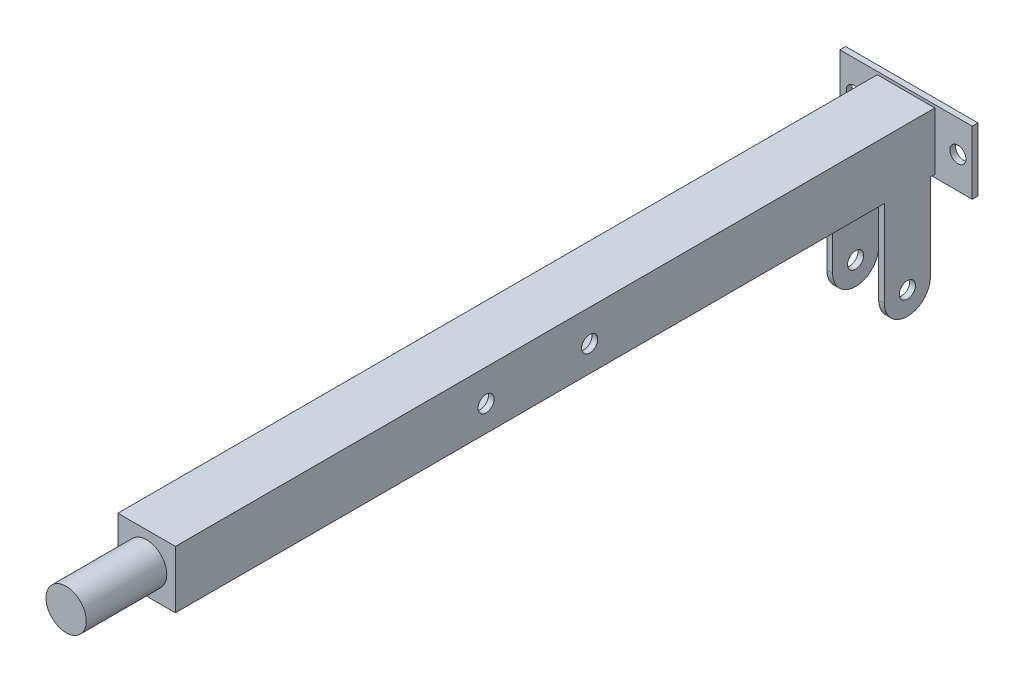
ISO-10303-21;
HEADER;
FILE_DESCRIPTION(('STEP AP214'),'2;1');
FILE_NAME('part.step','',(''),(''),'','','');
FILE_SCHEMA(('AUTOMOTIVE_DESIGN { 1 0 10303 214 1 1 1 1 }'));
ENDSEC;
DATA;
#1=APPLICATION_CONTEXT('core data for automotive mechanical design processes');
#2=APPLICATION_PROTOCOL_DEFINITION('international standard','automotive_design',2000,#1);
#3=PRODUCT_CONTEXT('',#1,'mechanical');
#4=PRODUCT('Part','Part','',(#3));
#5=PRODUCT_RELATED_PRODUCT_CATEGORY('part','',(#4));
#6=PRODUCT_DEFINITION_FORMATION('','',#4);
#7=PRODUCT_DEFINITION_CONTEXT('part definition',#1,'design');
#8=PRODUCT_DEFINITION('design','',#6,#7);
#9=PRODUCT_DEFINITION_SHAPE('','',#8);
#10=(LENGTH_UNIT() NAMED_UNIT(*) SI_UNIT(.MILLI.,.METRE.));
#11=(NAMED_UNIT(*) PLANE_ANGLE_UNIT() SI_UNIT($,.RADIAN.));
#12=(NAMED_UNIT(*) SI_UNIT($,.STERADIAN.) SOLID_ANGLE_UNIT());
#13=UNCERTAINTY_MEASURE_WITH_UNIT(LENGTH_MEASURE(1.E-05),#10,'distance_accuracy_value','');
#14=(GEOMETRIC_REPRESENTATION_CONTEXT(3) GLOBAL_UNCERTAINTY_ASSIGNED_CONTEXT((#13)) GLOBAL_UNIT_ASSIGNED_CONTEXT((#10,
#11,#12)) REPRESENTATION_CONTEXT('',''));
#15=CARTESIAN_POINT('',(0.,0.,0.));
#16=DIRECTION('',(0.,0.,1.));
#17=DIRECTION('',(1.,0.,0.));
#18=AXIS2_PLACEMENT_3D('',#15,#16,#17);
#19=CARTESIAN_POINT('',(-25.,-25.,0.));
#20=DIRECTION('',(0.,-1.,0.));
#21=DIRECTION('',(1.,0.,0.));
#22=AXIS2_PLACEMENT_3D('',#19,#20,#21);
#23=PLANE('',#22);
#24=DIRECTION('',(0.,0.,-1.));
#25=VECTOR('',#24,1.);
#26=CARTESIAN_POINT('',(25.,-25.,0.));
#27=LINE('',#26,#25);
#28=CARTESIAN_POINT('',(25.,-25.,-656.140431975243));
#29=VERTEX_POINT('',#28);
#30=CARTESIAN_POINT('',(25.,-25.,-660.));
#31=VERTEX_POINT('',#30);
#32=EDGE_CURVE('E206',#29,#31,#27,.T.);
#33=ORIENTED_EDGE('',*,*,#32,.F.);
#34=DIRECTION('',(1.,0.,0.));
#35=VECTOR('',#34,1.);
#36=CARTESIAN_POINT('',(20.,-25.,-656.140431975243));
#37=LINE('',#36,#35);
#38=CARTESIAN_POINT('',(20.,-25.,-656.140431975243));
#39=VERTEX_POINT('',#38);
#40=EDGE_CURVE('E188',#39,#29,#37,.T.);
#41=ORIENTED_EDGE('',*,*,#40,.F.);
#42=DIRECTION('',(0.,0.,1.));
#43=VECTOR('',#42,1.);
#44=CARTESIAN_POINT('',(20.,-25.,0.));
#45=LINE('',#44,#43);
#46=CARTESIAN_POINT('',(20.,-25.,-616.140431975243));
#47=VERTEX_POINT('',#46);
#48=EDGE_CURVE('E194',#39,#47,#45,.T.);
#49=ORIENTED_EDGE('',*,*,#48,.T.);
#50=DIRECTION('',(1.,0.,0.));
#51=VECTOR('',#50,1.);
#52=CARTESIAN_POINT('',(20.,-25.,-616.140431975243));
#53=LINE('',#52,#51);
#54=CARTESIAN_POINT('',(25.,-25.,-616.140431975243));
#55=VERTEX_POINT('',#54);
#56=EDGE_CURVE('E208',#47,#55,#53,.T.);
#57=ORIENTED_EDGE('',*,*,#56,.T.);
#58=CARTESIAN_POINT('',(25.,-25.,0.));
#59=VERTEX_POINT('',#58);
#60=EDGE_CURVE('E384',#59,#55,#27,.T.);
#61=ORIENTED_EDGE('',*,*,#60,.F.);
#62=DIRECTION('',(-1.,0.,0.));
#63=VECTOR('',#62,1.);
#64=CARTESIAN_POINT('',(-25.,-25.,0.));
#65=LINE('',#64,#63);
#66=CARTESIAN_POINT('',(-25.,-25.,0.));
#67=VERTEX_POINT('',#66);
#68=EDGE_CURVE('E380',#59,#67,#65,.T.);
#69=ORIENTED_EDGE('',*,*,#68,.T.);
#70=DIRECTION('',(0.,0.,-1.));
#71=VECTOR('',#70,1.);
#72=CARTESIAN_POINT('',(-25.,-25.,0.));
#73=LINE('',#72,#71);
#74=CARTESIAN_POINT('',(-25.,-25.,-616.140431975243));
#75=VERTEX_POINT('',#74);
#76=EDGE_CURVE('E358',#67,#75,#73,.T.);
#77=ORIENTED_EDGE('',*,*,#76,.T.);
#78=DIRECTION('',(-1.,0.,0.));
#79=VECTOR('',#78,1.);
#80=CARTESIAN_POINT('',(-20.,-25.,-616.140431975243));
#81=LINE('',#80,#79);
#82=CARTESIAN_POINT('',(-20.,-25.,-616.140431975243));
#83=VERTEX_POINT('',#82);
#84=EDGE_CURVE('E254',#83,#75,#81,.T.);
#85=ORIENTED_EDGE('',*,*,#84,.F.);
#86=DIRECTION('',(0.,0.,1.));
#87=VECTOR('',#86,1.);
#88=CARTESIAN_POINT('',(-20.,-25.,0.));
#89=LINE('',#88,#87);
#90=CARTESIAN_POINT('',(-20.,-25.,-656.140431975243));
#91=VERTEX_POINT('',#90);
#92=EDGE_CURVE('E69',#91,#83,#89,.T.);
#93=ORIENTED_EDGE('',*,*,#92,.F.);
#94=DIRECTION('',(-1.,0.,0.));
#95=VECTOR('',#94,1.);
#96=CARTESIAN_POINT('',(-20.,-25.,-656.140431975243));
#97=LINE('',#96,#95);
#98=CARTESIAN_POINT('',(-25.,-25.,-656.140431975243));
#99=VERTEX_POINT('',#98);
#100=EDGE_CURVE('E250',#91,#99,#97,.T.);
#101=ORIENTED_EDGE('',*,*,#100,.T.);
#102=CARTESIAN_POINT('',(-25.,-25.,-660.));
#103=VERTEX_POINT('',#102);
#104=EDGE_CURVE('E365',#99,#103,#73,.T.);
#105=ORIENTED_EDGE('',*,*,#104,.T.);
#106=DIRECTION('',(-1.,0.,0.));
#107=VECTOR('',#106,1.);
#108=CARTESIAN_POINT('',(-25.,-25.,-660.));
#109=LINE('',#108,#107);
#110=EDGE_CURVE('E388',#31,#103,#109,.T.);
#111=ORIENTED_EDGE('',*,*,#110,.F.);
#112=EDGE_LOOP('',(#33,#41,#49,#57,#61,#69,#77,#85,#93,#101,#105,#111));
#113=FACE_BOUND('',#112,.T.);
#114=ADVANCED_FACE('F43',(#113),#23,.T.);
#115=CARTESIAN_POINT('',(0.,0.,70.));
#116=DIRECTION('',(0.,0.,-1.));
#117=DIRECTION('',(-1.,0.,0.));
#118=AXIS2_PLACEMENT_3D('',#115,#116,#117);
#119=CYLINDRICAL_SURFACE('',#118,17.5);
#120=CARTESIAN_POINT('',(0.,0.,70.));
#121=DIRECTION('',(0.,0.,1.));
#122=DIRECTION('',(1.,0.,0.));
#123=AXIS2_PLACEMENT_3D('',#120,#121,#122);
#124=CIRCLE('',#123,17.5);
#125=CARTESIAN_POINT('',(17.5,0.,70.));
#126=VERTEX_POINT('',#125);
#127=EDGE_CURVE('E396',#126,#126,#124,.T.);
#128=ORIENTED_EDGE('',*,*,#127,.F.);
#129=EDGE_LOOP('',(#128));
#130=FACE_BOUND('',#129,.T.);
#131=CARTESIAN_POINT('',(0.,0.,0.));
#132=DIRECTION('',(0.,0.,1.));
#133=DIRECTION('',(1.,0.,0.));
#134=AXIS2_PLACEMENT_3D('',#131,#132,#133);
#135=CIRCLE('',#134,17.5);
#136=CARTESIAN_POINT('',(17.5,0.,0.));
#137=VERTEX_POINT('',#136);
#138=EDGE_CURVE('E395',#137,#137,#135,.T.);
#139=ORIENTED_EDGE('',*,*,#138,.T.);
#140=EDGE_LOOP('',(#139));
#141=FACE_BOUND('',#140,.T.);
#142=ADVANCED_FACE('F45',(#130,#141),#119,.T.);
#143=CARTESIAN_POINT('',(0.,0.,70.));
#144=DIRECTION('',(0.,0.,1.));
#145=DIRECTION('',(1.,0.,0.));
#146=AXIS2_PLACEMENT_3D('',#143,#144,#145);
#147=PLANE('',#146);
#148=ORIENTED_EDGE('',*,*,#127,.T.);
#149=EDGE_LOOP('',(#148));
#150=FACE_BOUND('',#149,.T.);
#151=ADVANCED_FACE('F566',(#150),#147,.T.);
#152=CARTESIAN_POINT('',(0.,0.,0.));
#153=DIRECTION('',(0.,0.,-1.));
#154=DIRECTION('',(-1.,0.,0.));
#155=AXIS2_PLACEMENT_3D('',#152,#153,#154);
#156=PLANE('',#155);
#157=ORIENTED_EDGE('',*,*,#138,.F.);
#158=EDGE_LOOP('',(#157));
#159=FACE_BOUND('',#158,.T.);
#160=DIRECTION('',(0.,-1.,0.));
#161=VECTOR('',#160,1.);
#162=CARTESIAN_POINT('',(25.,-25.,0.));
#163=LINE('',#162,#161);
#164=CARTESIAN_POINT('',(25.,25.,0.));
#165=VERTEX_POINT('',#164);
#166=EDGE_CURVE('E369',#165,#59,#163,.T.);
#167=ORIENTED_EDGE('',*,*,#166,.F.);
#168=DIRECTION('',(1.,0.,0.));
#169=VECTOR('',#168,1.);
#170=CARTESIAN_POINT('',(-25.,25.,0.));
#171=LINE('',#170,#169);
#172=CARTESIAN_POINT('',(-25.,25.,0.));
#173=VERTEX_POINT('',#172);
#174=EDGE_CURVE('E352',#173,#165,#171,.T.);
#175=ORIENTED_EDGE('',*,*,#174,.F.);
#176=DIRECTION('',(0.,1.,0.));
#177=VECTOR('',#176,1.);
#178=CARTESIAN_POINT('',(-25.,-25.,0.));
#179=LINE('',#178,#177);
#180=EDGE_CURVE('E348',#67,#173,#179,.T.);
#181=ORIENTED_EDGE('',*,*,#180,.F.);
#182=ORIENTED_EDGE('',*,*,#68,.F.);
#183=EDGE_LOOP('',(#167,#175,#181,#182));
#184=FACE_BOUND('',#183,.T.);
#185=ADVANCED_FACE('F564',(#159,#184),#156,.F.);
#186=CARTESIAN_POINT('',(-25.,-25.,0.));
#187=DIRECTION('',(-1.,0.,0.));
#188=DIRECTION('',(0.,0.,1.));
#189=AXIS2_PLACEMENT_3D('',#186,#187,#188);
#190=PLANE('',#189);
#191=CARTESIAN_POINT('',(-25.,-2.50000000001238,-270.000000000014));
#192=DIRECTION('',(-1.,0.,0.));
#193=DIRECTION('',(0.,0.,1.));
#194=AXIS2_PLACEMENT_3D('',#191,#192,#193);
#195=CIRCLE('',#194,6.99999999999999);
#196=CARTESIAN_POINT('',(-25.,-2.50000000001238,-263.000000000014));
#197=VERTEX_POINT('',#196);
#198=EDGE_CURVE('E451',#197,#197,#195,.T.);
#199=ORIENTED_EDGE('',*,*,#198,.F.);
#200=EDGE_LOOP('',(#199));
#201=FACE_BOUND('',#200,.T.);
#202=CARTESIAN_POINT('',(-25.,-2.50000000001238,-360.000000000014));
#203=DIRECTION('',(-1.,0.,0.));
#204=DIRECTION('',(0.,0.,1.));
#205=AXIS2_PLACEMENT_3D('',#202,#203,#204);
#206=CIRCLE('',#205,6.99999999999999);
#207=CARTESIAN_POINT('',(-25.,-2.50000000001238,-353.000000000014));
#208=VERTEX_POINT('',#207);
#209=EDGE_CURVE('E437',#208,#208,#206,.T.);
#210=ORIENTED_EDGE('',*,*,#209,.F.);
#211=EDGE_LOOP('',(#210));
#212=FACE_BOUND('',#211,.T.);
#213=CARTESIAN_POINT('',(-25.,-100.,-636.140431975243));
#214=DIRECTION('',(-1.,0.,0.));
#215=DIRECTION('',(0.,0.,1.));
#216=AXIS2_PLACEMENT_3D('',#213,#214,#215);
#217=CIRCLE('',#216,7.00000000000004);
#218=CARTESIAN_POINT('',(-25.,-100.,-629.140431975243));
#219=VERTEX_POINT('',#218);
#220=EDGE_CURVE('E219',#219,#219,#217,.T.);
#221=ORIENTED_EDGE('',*,*,#220,.F.);
#222=EDGE_LOOP('',(#221));
#223=FACE_BOUND('',#222,.T.);
#224=DIRECTION('',(0.,0.,-1.));
#225=VECTOR('',#224,1.);
#226=CARTESIAN_POINT('',(-25.,25.,0.));
#227=LINE('',#226,#225);
#228=CARTESIAN_POINT('',(-25.,25.,-660.));
#229=VERTEX_POINT('',#228);
#230=EDGE_CURVE('E357',#173,#229,#227,.T.);
#231=ORIENTED_EDGE('',*,*,#230,.T.);
#232=DIRECTION('',(0.,1.,0.));
#233=VECTOR('',#232,1.);
#234=CARTESIAN_POINT('',(-25.,-25.,-660.));
#235=LINE('',#234,#233);
#236=EDGE_CURVE('E353',#103,#229,#235,.T.);
#237=ORIENTED_EDGE('',*,*,#236,.F.);
#238=ORIENTED_EDGE('',*,*,#104,.F.);
#239=DIRECTION('',(0.,-1.,0.));
#240=VECTOR('',#239,1.);
#241=CARTESIAN_POINT('',(-25.,0.,-656.140431975243));
#242=LINE('',#241,#240);
#243=CARTESIAN_POINT('',(-25.,-100.,-656.140431975243));
#244=VERTEX_POINT('',#243);
#245=EDGE_CURVE('E239',#99,#244,#242,.T.);
#246=ORIENTED_EDGE('',*,*,#245,.T.);
#247=CARTESIAN_POINT('',(-25.,-100.,-636.140431975243));
#248=DIRECTION('',(-1.,0.,0.));
#249=DIRECTION('',(0.,0.,1.));
#250=AXIS2_PLACEMENT_3D('',#247,#248,#249);
#251=CIRCLE('',#250,20.);
#252=CARTESIAN_POINT('',(-25.,-100.,-616.140431975243));
#253=VERTEX_POINT('',#252);
#254=EDGE_CURVE('E243',#244,#253,#251,.T.);
#255=ORIENTED_EDGE('',*,*,#254,.T.);
#256=DIRECTION('',(0.,-1.,0.));
#257=VECTOR('',#256,1.);
#258=CARTESIAN_POINT('',(-25.,0.,-616.140431975243));
#259=LINE('',#258,#257);
#260=EDGE_CURVE('E229',#75,#253,#259,.T.);
#261=ORIENTED_EDGE('',*,*,#260,.F.);
#262=ORIENTED_EDGE('',*,*,#76,.F.);
#263=ORIENTED_EDGE('',*,*,#180,.T.);
#264=EDGE_LOOP('',(#231,#237,#238,#246,#255,#261,#262,#263));
#265=FACE_BOUND('',#264,.T.);
#266=ADVANCED_FACE('F484',(#201,#212,#223,#265),#190,.T.);
#267=CARTESIAN_POINT('',(-25.,25.,0.));
#268=DIRECTION('',(0.,1.,0.));
#269=DIRECTION('',(-1.,0.,0.));
#270=AXIS2_PLACEMENT_3D('',#267,#268,#269);
#271=PLANE('',#270);
#272=DIRECTION('',(0.,0.,-1.));
#273=VECTOR('',#272,1.);
#274=CARTESIAN_POINT('',(25.,25.,0.));
#275=LINE('',#274,#273);
#276=CARTESIAN_POINT('',(25.,25.,-660.));
#277=VERTEX_POINT('',#276);
#278=EDGE_CURVE('E373',#165,#277,#275,.T.);
#279=ORIENTED_EDGE('',*,*,#278,.T.);
#280=DIRECTION('',(1.,0.,0.));
#281=VECTOR('',#280,1.);
#282=CARTESIAN_POINT('',(-25.,25.,-660.));
#283=LINE('',#282,#281);
#284=EDGE_CURVE('E362',#229,#277,#283,.T.);
#285=ORIENTED_EDGE('',*,*,#284,.F.);
#286=ORIENTED_EDGE('',*,*,#230,.F.);
#287=ORIENTED_EDGE('',*,*,#174,.T.);
#288=EDGE_LOOP('',(#279,#285,#286,#287));
#289=FACE_BOUND('',#288,.T.);
#290=ADVANCED_FACE('F563',(#289),#271,.T.);
#291=CARTESIAN_POINT('',(25.,-25.,0.));
#292=DIRECTION('',(1.,0.,0.));
#293=DIRECTION('',(0.,0.,-1.));
#294=AXIS2_PLACEMENT_3D('',#291,#292,#293);
#295=PLANE('',#294);
#296=CARTESIAN_POINT('',(25.,-2.50000000001238,-270.000000000014));
#297=DIRECTION('',(1.,0.,0.));
#298=DIRECTION('',(0.,0.,-1.));
#299=AXIS2_PLACEMENT_3D('',#296,#297,#298);
#300=CIRCLE('',#299,6.99999999999999);
#301=CARTESIAN_POINT('',(25.,-2.50000000001238,-277.000000000014));
#302=VERTEX_POINT('',#301);
#303=EDGE_CURVE('E447',#302,#302,#300,.T.);
#304=ORIENTED_EDGE('',*,*,#303,.F.);
#305=EDGE_LOOP('',(#304));
#306=FACE_BOUND('',#305,.T.);
#307=CARTESIAN_POINT('',(25.,-2.50000000001238,-360.000000000014));
#308=DIRECTION('',(1.,0.,0.));
#309=DIRECTION('',(0.,0.,-1.));
#310=AXIS2_PLACEMENT_3D('',#307,#308,#309);
#311=CIRCLE('',#310,6.99999999999999);
#312=CARTESIAN_POINT('',(25.,-2.50000000001238,-367.000000000014));
#313=VERTEX_POINT('',#312);
#314=EDGE_CURVE('E430',#313,#313,#311,.T.);
#315=ORIENTED_EDGE('',*,*,#314,.F.);
#316=EDGE_LOOP('',(#315));
#317=FACE_BOUND('',#316,.T.);
#318=CARTESIAN_POINT('',(25.,-100.,-636.140431975243));
#319=DIRECTION('',(-1.,0.,0.));
#320=DIRECTION('',(0.,0.,1.));
#321=AXIS2_PLACEMENT_3D('',#318,#319,#320);
#322=CIRCLE('',#321,7.00000000000004);
#323=CARTESIAN_POINT('',(25.,-100.,-629.140431975243));
#324=VERTEX_POINT('',#323);
#325=EDGE_CURVE('E420',#324,#324,#322,.T.);
#326=ORIENTED_EDGE('',*,*,#325,.T.);
#327=EDGE_LOOP('',(#326));
#328=FACE_BOUND('',#327,.T.);
#329=ORIENTED_EDGE('',*,*,#60,.T.);
#330=DIRECTION('',(0.,-1.,0.));
#331=VECTOR('',#330,1.);
#332=CARTESIAN_POINT('',(25.,0.,-616.140431975243));
#333=LINE('',#332,#331);
#334=CARTESIAN_POINT('',(25.,-100.,-616.140431975243));
#335=VERTEX_POINT('',#334);
#336=EDGE_CURVE('E462',#55,#335,#333,.T.);
#337=ORIENTED_EDGE('',*,*,#336,.T.);
#338=CARTESIAN_POINT('',(25.,-100.,-636.140431975243));
#339=DIRECTION('',(-1.,0.,0.));
#340=DIRECTION('',(0.,0.,1.));
#341=AXIS2_PLACEMENT_3D('',#338,#339,#340);
#342=CIRCLE('',#341,20.);
#343=CARTESIAN_POINT('',(25.,-100.,-656.140431975243));
#344=VERTEX_POINT('',#343);
#345=EDGE_CURVE('E195',#344,#335,#342,.T.);
#346=ORIENTED_EDGE('',*,*,#345,.F.);
#347=DIRECTION('',(0.,-1.,0.));
#348=VECTOR('',#347,1.);
#349=CARTESIAN_POINT('',(25.,0.,-656.140431975243));
#350=LINE('',#349,#348);
#351=EDGE_CURVE('E61',#29,#344,#350,.T.);
#352=ORIENTED_EDGE('',*,*,#351,.F.);
#353=ORIENTED_EDGE('',*,*,#32,.T.);
#354=DIRECTION('',(0.,-1.,0.));
#355=VECTOR('',#354,1.);
#356=CARTESIAN_POINT('',(25.,-25.,-660.));
#357=LINE('',#356,#355);
#358=EDGE_CURVE('E376',#277,#31,#357,.T.);
#359=ORIENTED_EDGE('',*,*,#358,.F.);
#360=ORIENTED_EDGE('',*,*,#278,.F.);
#361=ORIENTED_EDGE('',*,*,#166,.T.);
#362=EDGE_LOOP('',(#329,#337,#346,#352,#353,#359,#360,#361));
#363=FACE_BOUND('',#362,.T.);
#364=ADVANCED_FACE('F477',(#306,#317,#328,#363),#295,.T.);
#365=CARTESIAN_POINT('',(0.,0.,-660.));
#366=DIRECTION('',(0.,0.,-1.));
#367=DIRECTION('',(-1.,0.,0.));
#368=AXIS2_PLACEMENT_3D('',#365,#366,#367);
#369=PLANE('',#368);
#370=CARTESIAN_POINT('',(-45.,0.,-660.));
#371=DIRECTION('',(0.,0.,-1.));
#372=DIRECTION('',(-1.,0.,0.));
#373=AXIS2_PLACEMENT_3D('',#370,#371,#372);
#374=CIRCLE('',#373,7.);
#375=CARTESIAN_POINT('',(-52.,0.,-660.));
#376=VERTEX_POINT('',#375);
#377=EDGE_CURVE('E253',#376,#376,#374,.T.);
#378=ORIENTED_EDGE('',*,*,#377,.T.);
#379=EDGE_LOOP('',(#378));
#380=FACE_BOUND('',#379,.T.);
#381=CARTESIAN_POINT('',(45.,0.,-660.));
#382=DIRECTION('',(0.,0.,-1.));
#383=DIRECTION('',(-1.,0.,0.));
#384=AXIS2_PLACEMENT_3D('',#381,#382,#383);
#385=CIRCLE('',#384,7.);
#386=CARTESIAN_POINT('',(38.,0.,-660.));
#387=VERTEX_POINT('',#386);
#388=EDGE_CURVE('E267',#387,#387,#385,.T.);
#389=ORIENTED_EDGE('',*,*,#388,.T.);
#390=EDGE_LOOP('',(#389));
#391=FACE_BOUND('',#390,.T.);
#392=DIRECTION('',(0.,-1.,0.));
#393=VECTOR('',#392,1.);
#394=CARTESIAN_POINT('',(57.5,-27.5,-660.));
#395=LINE('',#394,#393);
#396=CARTESIAN_POINT('',(57.5,27.5,-660.));
#397=VERTEX_POINT('',#396);
#398=CARTESIAN_POINT('',(57.5,-27.5,-660.));
#399=VERTEX_POINT('',#398);
#400=EDGE_CURVE('E275',#397,#399,#395,.T.);
#401=ORIENTED_EDGE('',*,*,#400,.F.);
#402=DIRECTION('',(1.,0.,0.));
#403=VECTOR('',#402,1.);
#404=CARTESIAN_POINT('',(-57.5,27.5,-660.));
#405=LINE('',#404,#403);
#406=CARTESIAN_POINT('',(-57.5,27.5,-660.));
#407=VERTEX_POINT('',#406);
#408=EDGE_CURVE('E284',#407,#397,#405,.T.);
#409=ORIENTED_EDGE('',*,*,#408,.F.);
#410=DIRECTION('',(0.,1.,0.));
#411=VECTOR('',#410,1.);
#412=CARTESIAN_POINT('',(-57.5,-27.5,-660.));
#413=LINE('',#412,#411);
#414=CARTESIAN_POINT('',(-57.5,-27.5,-660.));
#415=VERTEX_POINT('',#414);
#416=EDGE_CURVE('E300',#415,#407,#413,.T.);
#417=ORIENTED_EDGE('',*,*,#416,.F.);
#418=DIRECTION('',(-1.,0.,0.));
#419=VECTOR('',#418,1.);
#420=CARTESIAN_POINT('',(-57.5,-27.5,-660.));
#421=LINE('',#420,#419);
#422=EDGE_CURVE('E297',#399,#415,#421,.T.);
#423=ORIENTED_EDGE('',*,*,#422,.F.);
#424=EDGE_LOOP('',(#401,#409,#417,#423));
#425=FACE_BOUND('',#424,.T.);
#426=ORIENTED_EDGE('',*,*,#284,.T.);
#427=ORIENTED_EDGE('',*,*,#358,.T.);
#428=ORIENTED_EDGE('',*,*,#110,.T.);
#429=ORIENTED_EDGE('',*,*,#236,.T.);
#430=EDGE_LOOP('',(#426,#427,#428,#429));
#431=FACE_BOUND('',#430,.T.);
#432=ADVANCED_FACE('F501',(#380,#391,#425,#431),#369,.F.);
#433=CARTESIAN_POINT('',(0.,0.,-665.));
#434=DIRECTION('',(0.,0.,-1.));
#435=DIRECTION('',(-1.,0.,0.));
#436=AXIS2_PLACEMENT_3D('',#433,#434,#435);
#437=PLANE('',#436);
#438=CARTESIAN_POINT('',(45.,0.,-665.));
#439=DIRECTION('',(0.,0.,-1.));
#440=DIRECTION('',(-1.,0.,0.));
#441=AXIS2_PLACEMENT_3D('',#438,#439,#440);
#442=CIRCLE('',#441,7.);
#443=CARTESIAN_POINT('',(38.,0.,-665.));
#444=VERTEX_POINT('',#443);
#445=EDGE_CURVE('E271',#444,#444,#442,.T.);
#446=ORIENTED_EDGE('',*,*,#445,.F.);
#447=EDGE_LOOP('',(#446));
#448=FACE_BOUND('',#447,.T.);
#449=DIRECTION('',(0.,-1.,0.));
#450=VECTOR('',#449,1.);
#451=CARTESIAN_POINT('',(57.5,-27.5,-665.));
#452=LINE('',#451,#450);
#453=CARTESIAN_POINT('',(57.5,27.5,-665.));
#454=VERTEX_POINT('',#453);
#455=CARTESIAN_POINT('',(57.5,-27.5,-665.));
#456=VERTEX_POINT('',#455);
#457=EDGE_CURVE('E279',#454,#456,#452,.T.);
#458=ORIENTED_EDGE('',*,*,#457,.T.);
#459=DIRECTION('',(-1.,0.,0.));
#460=VECTOR('',#459,1.);
#461=CARTESIAN_POINT('',(-57.5,-27.5,-665.));
#462=LINE('',#461,#460);
#463=CARTESIAN_POINT('',(-57.5,-27.5,-665.));
#464=VERTEX_POINT('',#463);
#465=EDGE_CURVE('E283',#456,#464,#462,.T.);
#466=ORIENTED_EDGE('',*,*,#465,.T.);
#467=DIRECTION('',(0.,1.,0.));
#468=VECTOR('',#467,1.);
#469=CARTESIAN_POINT('',(-57.5,-27.5,-665.));
#470=LINE('',#469,#468);
#471=CARTESIAN_POINT('',(-57.5,27.5,-665.));
#472=VERTEX_POINT('',#471);
#473=EDGE_CURVE('E287',#464,#472,#470,.T.);
#474=ORIENTED_EDGE('',*,*,#473,.T.);
#475=DIRECTION('',(1.,0.,0.));
#476=VECTOR('',#475,1.);
#477=CARTESIAN_POINT('',(-57.5,27.5,-665.));
#478=LINE('',#477,#476);
#479=EDGE_CURVE('E290',#472,#454,#478,.T.);
#480=ORIENTED_EDGE('',*,*,#479,.T.);
#481=EDGE_LOOP('',(#458,#466,#474,#480));
#482=FACE_BOUND('',#481,.T.);
#483=CARTESIAN_POINT('',(-45.,0.,-665.));
#484=DIRECTION('',(0.,0.,-1.));
#485=DIRECTION('',(-1.,0.,0.));
#486=AXIS2_PLACEMENT_3D('',#483,#484,#485);
#487=CIRCLE('',#486,7.);
#488=CARTESIAN_POINT('',(-52.,0.,-665.));
#489=VERTEX_POINT('',#488);
#490=EDGE_CURVE('E263',#489,#489,#487,.T.);
#491=ORIENTED_EDGE('',*,*,#490,.F.);
#492=EDGE_LOOP('',(#491));
#493=FACE_BOUND('',#492,.T.);
#494=ADVANCED_FACE('F580',(#448,#482,#493),#437,.T.);
#495=CARTESIAN_POINT('',(57.5,-27.5,-665.));
#496=DIRECTION('',(-1.,0.,0.));
#497=DIRECTION('',(0.,-1.,0.));
#498=AXIS2_PLACEMENT_3D('',#495,#496,#497);
#499=PLANE('',#498);
#500=ORIENTED_EDGE('',*,*,#400,.T.);
#501=DIRECTION('',(0.,0.,1.));
#502=VECTOR('',#501,1.);
#503=CARTESIAN_POINT('',(57.5,-27.5,-665.));
#504=LINE('',#503,#502);
#505=EDGE_CURVE('E316',#456,#399,#504,.T.);
#506=ORIENTED_EDGE('',*,*,#505,.F.);
#507=ORIENTED_EDGE('',*,*,#457,.F.);
#508=DIRECTION('',(0.,0.,1.));
#509=VECTOR('',#508,1.);
#510=CARTESIAN_POINT('',(57.5,27.5,-665.));
#511=LINE('',#510,#509);
#512=EDGE_CURVE('E293',#454,#397,#511,.T.);
#513=ORIENTED_EDGE('',*,*,#512,.T.);
#514=EDGE_LOOP('',(#500,#506,#507,#513));
#515=FACE_BOUND('',#514,.T.);
#516=ADVANCED_FACE('F616',(#515),#499,.F.);
#517=CARTESIAN_POINT('',(-57.5,-27.5,-665.));
#518=DIRECTION('',(0.,1.,0.));
#519=DIRECTION('',(-1.,0.,0.));
#520=AXIS2_PLACEMENT_3D('',#517,#518,#519);
#521=PLANE('',#520);
#522=ORIENTED_EDGE('',*,*,#422,.T.);
#523=DIRECTION('',(0.,0.,1.));
#524=VECTOR('',#523,1.);
#525=CARTESIAN_POINT('',(-57.5,-27.5,-665.));
#526=LINE('',#525,#524);
#527=EDGE_CURVE('E312',#464,#415,#526,.T.);
#528=ORIENTED_EDGE('',*,*,#527,.F.);
#529=ORIENTED_EDGE('',*,*,#465,.F.);
#530=ORIENTED_EDGE('',*,*,#505,.T.);
#531=EDGE_LOOP('',(#522,#528,#529,#530));
#532=FACE_BOUND('',#531,.T.);
#533=ADVANCED_FACE('F619',(#532),#521,.F.);
#534=CARTESIAN_POINT('',(-57.5,-27.5,-665.));
#535=DIRECTION('',(1.,0.,0.));
#536=DIRECTION('',(0.,0.,-1.));
#537=AXIS2_PLACEMENT_3D('',#534,#535,#536);
#538=PLANE('',#537);
#539=ORIENTED_EDGE('',*,*,#416,.T.);
#540=DIRECTION('',(0.,0.,1.));
#541=VECTOR('',#540,1.);
#542=CARTESIAN_POINT('',(-57.5,27.5,-665.));
#543=LINE('',#542,#541);
#544=EDGE_CURVE('E308',#472,#407,#543,.T.);
#545=ORIENTED_EDGE('',*,*,#544,.F.);
#546=ORIENTED_EDGE('',*,*,#473,.F.);
#547=ORIENTED_EDGE('',*,*,#527,.T.);
#548=EDGE_LOOP('',(#539,#545,#546,#547));
#549=FACE_BOUND('',#548,.T.);
#550=ADVANCED_FACE('F623',(#549),#538,.F.);
#551=CARTESIAN_POINT('',(-57.5,27.5,-665.));
#552=DIRECTION('',(0.,-1.,0.));
#553=DIRECTION('',(1.,0.,0.));
#554=AXIS2_PLACEMENT_3D('',#551,#552,#553);
#555=PLANE('',#554);
#556=ORIENTED_EDGE('',*,*,#408,.T.);
#557=ORIENTED_EDGE('',*,*,#512,.F.);
#558=ORIENTED_EDGE('',*,*,#479,.F.);
#559=ORIENTED_EDGE('',*,*,#544,.T.);
#560=EDGE_LOOP('',(#556,#557,#558,#559));
#561=FACE_BOUND('',#560,.T.);
#562=ADVANCED_FACE('F627',(#561),#555,.F.);
#563=CARTESIAN_POINT('',(45.,0.,-665.));
#564=DIRECTION('',(0.,0.,1.));
#565=DIRECTION('',(1.,0.,0.));
#566=AXIS2_PLACEMENT_3D('',#563,#564,#565);
#567=CYLINDRICAL_SURFACE('',#566,7.);
#568=ORIENTED_EDGE('',*,*,#445,.T.);
#569=EDGE_LOOP('',(#568));
#570=FACE_BOUND('',#569,.T.);
#571=ORIENTED_EDGE('',*,*,#388,.F.);
#572=EDGE_LOOP('',(#571));
#573=FACE_BOUND('',#572,.T.);
#574=ADVANCED_FACE('F630',(#570,#573),#567,.F.);
#575=CARTESIAN_POINT('',(-45.,0.,-665.));
#576=DIRECTION('',(0.,0.,1.));
#577=DIRECTION('',(1.,0.,0.));
#578=AXIS2_PLACEMENT_3D('',#575,#576,#577);
#579=CYLINDRICAL_SURFACE('',#578,7.);
#580=ORIENTED_EDGE('',*,*,#490,.T.);
#581=EDGE_LOOP('',(#580));
#582=FACE_BOUND('',#581,.T.);
#583=ORIENTED_EDGE('',*,*,#377,.F.);
#584=EDGE_LOOP('',(#583));
#585=FACE_BOUND('',#584,.T.);
#586=ADVANCED_FACE('F638',(#582,#585),#579,.F.);
#587=CARTESIAN_POINT('',(-20.,0.,-656.140431975243));
#588=DIRECTION('',(0.,0.,-1.));
#589=DIRECTION('',(-1.,0.,0.));
#590=AXIS2_PLACEMENT_3D('',#587,#588,#589);
#591=PLANE('',#590);
#592=ORIENTED_EDGE('',*,*,#245,.F.);
#593=ORIENTED_EDGE('',*,*,#100,.F.);
#594=DIRECTION('',(0.,-1.,0.));
#595=VECTOR('',#594,1.);
#596=CARTESIAN_POINT('',(-20.,0.,-656.140431975243));
#597=LINE('',#596,#595);
#598=CARTESIAN_POINT('',(-20.,-100.,-656.140431975243));
#599=VERTEX_POINT('',#598);
#600=EDGE_CURVE('E224',#91,#599,#597,.T.);
#601=ORIENTED_EDGE('',*,*,#600,.T.);
#602=DIRECTION('',(-1.,0.,0.));
#603=VECTOR('',#602,1.);
#604=CARTESIAN_POINT('',(-20.,-100.,-656.140431975243));
#605=LINE('',#604,#603);
#606=EDGE_CURVE('E238',#599,#244,#605,.T.);
#607=ORIENTED_EDGE('',*,*,#606,.T.);
#608=EDGE_LOOP('',(#592,#593,#601,#607));
#609=FACE_BOUND('',#608,.T.);
#610=ADVANCED_FACE('F497',(#609),#591,.T.);
#611=CARTESIAN_POINT('',(-20.,0.,-616.140431975243));
#612=DIRECTION('',(0.,0.,-1.));
#613=DIRECTION('',(-1.,0.,0.));
#614=AXIS2_PLACEMENT_3D('',#611,#612,#613);
#615=PLANE('',#614);
#616=ORIENTED_EDGE('',*,*,#260,.T.);
#617=DIRECTION('',(-1.,0.,0.));
#618=VECTOR('',#617,1.);
#619=CARTESIAN_POINT('',(-20.,-100.,-616.140431975243));
#620=LINE('',#619,#618);
#621=CARTESIAN_POINT('',(-20.,-100.,-616.140431975243));
#622=VERTEX_POINT('',#621);
#623=EDGE_CURVE('E258',#622,#253,#620,.T.);
#624=ORIENTED_EDGE('',*,*,#623,.F.);
#625=DIRECTION('',(0.,-1.,0.));
#626=VECTOR('',#625,1.);
#627=CARTESIAN_POINT('',(-20.,0.,-616.140431975243));
#628=LINE('',#627,#626);
#629=EDGE_CURVE('E233',#83,#622,#628,.T.);
#630=ORIENTED_EDGE('',*,*,#629,.F.);
#631=ORIENTED_EDGE('',*,*,#84,.T.);
#632=EDGE_LOOP('',(#616,#624,#630,#631));
#633=FACE_BOUND('',#632,.T.);
#634=ADVANCED_FACE('F489',(#633),#615,.F.);
#635=CARTESIAN_POINT('',(-20.,-100.,-636.140431975243));
#636=DIRECTION('',(-1.,0.,0.));
#637=DIRECTION('',(0.,0.,1.));
#638=AXIS2_PLACEMENT_3D('',#635,#636,#637);
#639=CYLINDRICAL_SURFACE('',#638,20.);
#640=ORIENTED_EDGE('',*,*,#254,.F.);
#641=ORIENTED_EDGE('',*,*,#606,.F.);
#642=CARTESIAN_POINT('',(-20.,-100.,-636.140431975243));
#643=DIRECTION('',(-1.,0.,0.));
#644=DIRECTION('',(0.,0.,1.));
#645=AXIS2_PLACEMENT_3D('',#642,#643,#644);
#646=CIRCLE('',#645,20.);
#647=EDGE_CURVE('E228',#599,#622,#646,.T.);
#648=ORIENTED_EDGE('',*,*,#647,.T.);
#649=ORIENTED_EDGE('',*,*,#623,.T.);
#650=EDGE_LOOP('',(#640,#641,#648,#649));
#651=FACE_BOUND('',#650,.T.);
#652=ADVANCED_FACE('F645',(#651),#639,.T.);
#653=CARTESIAN_POINT('',(-20.,0.,0.));
#654=DIRECTION('',(-1.,0.,0.));
#655=DIRECTION('',(0.,0.,1.));
#656=AXIS2_PLACEMENT_3D('',#653,#654,#655);
#657=PLANE('',#656);
#658=CARTESIAN_POINT('',(-20.,-100.,-636.140431975243));
#659=DIRECTION('',(-1.,0.,0.));
#660=DIRECTION('',(0.,0.,1.));
#661=AXIS2_PLACEMENT_3D('',#658,#659,#660);
#662=CIRCLE('',#661,7.00000000000004);
#663=CARTESIAN_POINT('',(-20.,-100.,-629.140431975243));
#664=VERTEX_POINT('',#663);
#665=EDGE_CURVE('E223',#664,#664,#662,.T.);
#666=ORIENTED_EDGE('',*,*,#665,.T.);
#667=EDGE_LOOP('',(#666));
#668=FACE_BOUND('',#667,.T.);
#669=ORIENTED_EDGE('',*,*,#600,.F.);
#670=ORIENTED_EDGE('',*,*,#92,.T.);
#671=ORIENTED_EDGE('',*,*,#629,.T.);
#672=ORIENTED_EDGE('',*,*,#647,.F.);
#673=EDGE_LOOP('',(#669,#670,#671,#672));
#674=FACE_BOUND('',#673,.T.);
#675=ADVANCED_FACE('F493',(#668,#674),#657,.F.);
#676=CARTESIAN_POINT('',(57.5,-100.,-636.140431975243));
#677=DIRECTION('',(-1.,0.,0.));
#678=DIRECTION('',(0.,0.,1.));
#679=AXIS2_PLACEMENT_3D('',#676,#677,#678);
#680=CYLINDRICAL_SURFACE('',#679,7.00000000000004);
#681=ORIENTED_EDGE('',*,*,#220,.T.);
#682=EDGE_LOOP('',(#681));
#683=FACE_BOUND('',#682,.T.);
#684=ORIENTED_EDGE('',*,*,#665,.F.);
#685=EDGE_LOOP('',(#684));
#686=FACE_BOUND('',#685,.T.);
#687=ADVANCED_FACE('F653',(#683,#686),#680,.F.);
#688=CARTESIAN_POINT('',(20.,0.,-656.140431975243));
#689=DIRECTION('',(0.,0.,1.));
#690=DIRECTION('',(1.,0.,0.));
#691=AXIS2_PLACEMENT_3D('',#688,#689,#690);
#692=PLANE('',#691);
#693=ORIENTED_EDGE('',*,*,#351,.T.);
#694=DIRECTION('',(1.,0.,0.));
#695=VECTOR('',#694,1.);
#696=CARTESIAN_POINT('',(20.,-100.,-656.140431975243));
#697=LINE('',#696,#695);
#698=CARTESIAN_POINT('',(20.,-100.,-656.140431975243));
#699=VERTEX_POINT('',#698);
#700=EDGE_CURVE('E191',#699,#344,#697,.T.);
#701=ORIENTED_EDGE('',*,*,#700,.F.);
#702=DIRECTION('',(0.,-1.,0.));
#703=VECTOR('',#702,1.);
#704=CARTESIAN_POINT('',(20.,0.,-656.140431975243));
#705=LINE('',#704,#703);
#706=EDGE_CURVE('E184',#39,#699,#705,.T.);
#707=ORIENTED_EDGE('',*,*,#706,.F.);
#708=ORIENTED_EDGE('',*,*,#40,.T.);
#709=EDGE_LOOP('',(#693,#701,#707,#708));
#710=FACE_BOUND('',#709,.T.);
#711=ADVANCED_FACE('F186',(#710),#692,.F.);
#712=CARTESIAN_POINT('',(20.,-100.,-636.140431975243));
#713=DIRECTION('',(1.,0.,0.));
#714=DIRECTION('',(0.,0.,-1.));
#715=AXIS2_PLACEMENT_3D('',#712,#713,#714);
#716=CYLINDRICAL_SURFACE('',#715,20.);
#717=ORIENTED_EDGE('',*,*,#345,.T.);
#718=DIRECTION('',(1.,0.,0.));
#719=VECTOR('',#718,1.);
#720=CARTESIAN_POINT('',(20.,-100.,-616.140431975243));
#721=LINE('',#720,#719);
#722=CARTESIAN_POINT('',(20.,-100.,-616.140431975243));
#723=VERTEX_POINT('',#722);
#724=EDGE_CURVE('E214',#723,#335,#721,.T.);
#725=ORIENTED_EDGE('',*,*,#724,.F.);
#726=CARTESIAN_POINT('',(20.,-100.,-636.140431975243));
#727=DIRECTION('',(-1.,0.,0.));
#728=DIRECTION('',(0.,0.,1.));
#729=AXIS2_PLACEMENT_3D('',#726,#727,#728);
#730=CIRCLE('',#729,20.);
#731=EDGE_CURVE('E209',#699,#723,#730,.T.);
#732=ORIENTED_EDGE('',*,*,#731,.F.);
#733=ORIENTED_EDGE('',*,*,#700,.T.);
#734=EDGE_LOOP('',(#717,#725,#732,#733));
#735=FACE_BOUND('',#734,.T.);
#736=ADVANCED_FACE('F476',(#735),#716,.T.);
#737=CARTESIAN_POINT('',(20.,0.,-616.140431975243));
#738=DIRECTION('',(0.,0.,1.));
#739=DIRECTION('',(1.,0.,0.));
#740=AXIS2_PLACEMENT_3D('',#737,#738,#739);
#741=PLANE('',#740);
#742=ORIENTED_EDGE('',*,*,#336,.F.);
#743=ORIENTED_EDGE('',*,*,#56,.F.);
#744=DIRECTION('',(0.,-1.,0.));
#745=VECTOR('',#744,1.);
#746=CARTESIAN_POINT('',(20.,0.,-616.140431975243));
#747=LINE('',#746,#745);
#748=EDGE_CURVE('E201',#47,#723,#747,.T.);
#749=ORIENTED_EDGE('',*,*,#748,.T.);
#750=ORIENTED_EDGE('',*,*,#724,.T.);
#751=EDGE_LOOP('',(#742,#743,#749,#750));
#752=FACE_BOUND('',#751,.T.);
#753=ADVANCED_FACE('F474',(#752),#741,.T.);
#754=CARTESIAN_POINT('',(20.,0.,0.));
#755=DIRECTION('',(1.,0.,0.));
#756=DIRECTION('',(0.,0.,1.));
#757=AXIS2_PLACEMENT_3D('',#754,#755,#756);
#758=PLANE('',#757);
#759=CARTESIAN_POINT('',(20.,-100.,-636.140431975243));
#760=DIRECTION('',(1.,0.,0.));
#761=DIRECTION('',(0.,0.,-1.));
#762=AXIS2_PLACEMENT_3D('',#759,#760,#761);
#763=CIRCLE('',#762,7.00000000000004);
#764=CARTESIAN_POINT('',(20.,-100.,-643.140431975243));
#765=VERTEX_POINT('',#764);
#766=EDGE_CURVE('E417',#765,#765,#763,.F.);
#767=ORIENTED_EDGE('',*,*,#766,.F.);
#768=EDGE_LOOP('',(#767));
#769=FACE_BOUND('',#768,.T.);
#770=ORIENTED_EDGE('',*,*,#706,.T.);
#771=ORIENTED_EDGE('',*,*,#731,.T.);
#772=ORIENTED_EDGE('',*,*,#748,.F.);
#773=ORIENTED_EDGE('',*,*,#48,.F.);
#774=EDGE_LOOP('',(#770,#771,#772,#773));
#775=FACE_BOUND('',#774,.T.);
#776=ADVANCED_FACE('F199',(#769,#775),#758,.F.);
#777=CARTESIAN_POINT('',(-57.5,-100.,-636.140431975243));
#778=DIRECTION('',(1.,0.,0.));
#779=DIRECTION('',(0.,0.,-1.));
#780=AXIS2_PLACEMENT_3D('',#777,#778,#779);
#781=CYLINDRICAL_SURFACE('',#780,7.00000000000004);
#782=ORIENTED_EDGE('',*,*,#325,.F.);
#783=EDGE_LOOP('',(#782));
#784=FACE_BOUND('',#783,.T.);
#785=ORIENTED_EDGE('',*,*,#766,.T.);
#786=EDGE_LOOP('',(#785));
#787=FACE_BOUND('',#786,.T.);
#788=ADVANCED_FACE('F664',(#784,#787),#781,.F.);
#789=CARTESIAN_POINT('',(-57.5,-2.50000000001238,-360.000000000014));
#790=DIRECTION('',(1.,0.,0.));
#791=DIRECTION('',(0.,0.,-1.));
#792=AXIS2_PLACEMENT_3D('',#789,#790,#791);
#793=CYLINDRICAL_SURFACE('',#792,6.99999999999999);
#794=ORIENTED_EDGE('',*,*,#314,.T.);
#795=EDGE_LOOP('',(#794));
#796=FACE_BOUND('',#795,.T.);
#797=CARTESIAN_POINT('',(20.,-2.50000000001238,-360.000000000014));
#798=DIRECTION('',(-1.,0.,0.));
#799=DIRECTION('',(0.,0.,1.));
#800=AXIS2_PLACEMENT_3D('',#797,#798,#799);
#801=CIRCLE('',#800,6.99999999999999);
#802=CARTESIAN_POINT('',(20.,-2.50000000001238,-353.000000000014));
#803=VERTEX_POINT('',#802);
#804=EDGE_CURVE('E421',#803,#803,#801,.T.);
#805=ORIENTED_EDGE('',*,*,#804,.T.);
#806=EDGE_LOOP('',(#805));
#807=FACE_BOUND('',#806,.T.);
#808=ADVANCED_FACE('F668',(#796,#807),#793,.F.);
#809=CARTESIAN_POINT('',(-57.5,-2.50000000001238,-270.000000000014));
#810=DIRECTION('',(1.,0.,0.));
#811=DIRECTION('',(0.,0.,-1.));
#812=AXIS2_PLACEMENT_3D('',#809,#810,#811);
#813=CYLINDRICAL_SURFACE('',#812,6.99999999999999);
#814=ORIENTED_EDGE('',*,*,#303,.T.);
#815=EDGE_LOOP('',(#814));
#816=FACE_BOUND('',#815,.T.);
#817=CARTESIAN_POINT('',(20.,-2.50000000001238,-270.000000000014));
#818=DIRECTION('',(-1.,0.,0.));
#819=DIRECTION('',(0.,0.,1.));
#820=AXIS2_PLACEMENT_3D('',#817,#818,#819);
#821=CIRCLE('',#820,6.99999999999999);
#822=CARTESIAN_POINT('',(20.,-2.50000000001238,-263.000000000014));
#823=VERTEX_POINT('',#822);
#824=EDGE_CURVE('E47',#823,#823,#821,.T.);
#825=ORIENTED_EDGE('',*,*,#824,.T.);
#826=EDGE_LOOP('',(#825));
#827=FACE_BOUND('',#826,.T.);
#828=ADVANCED_FACE('F672',(#816,#827),#813,.F.);
#829=ORIENTED_EDGE('',*,*,#209,.T.);
#830=EDGE_LOOP('',(#829));
#831=FACE_BOUND('',#830,.T.);
#832=CARTESIAN_POINT('',(-20.,-2.50000000001238,-360.000000000014));
#833=DIRECTION('',(1.,0.,0.));
#834=DIRECTION('',(0.,0.,-1.));
#835=AXIS2_PLACEMENT_3D('',#832,#833,#834);
#836=CIRCLE('',#835,6.99999999999999);
#837=CARTESIAN_POINT('',(-20.,-2.50000000001238,-367.000000000014));
#838=VERTEX_POINT('',#837);
#839=EDGE_CURVE('E424',#838,#838,#836,.T.);
#840=ORIENTED_EDGE('',*,*,#839,.T.);
#841=EDGE_LOOP('',(#840));
#842=FACE_BOUND('',#841,.T.);
#843=ADVANCED_FACE('F674',(#831,#842),#793,.F.);
#844=ORIENTED_EDGE('',*,*,#198,.T.);
#845=EDGE_LOOP('',(#844));
#846=FACE_BOUND('',#845,.T.);
#847=CARTESIAN_POINT('',(-20.,-2.50000000001238,-270.000000000014));
#848=DIRECTION('',(1.,0.,0.));
#849=DIRECTION('',(0.,0.,-1.));
#850=AXIS2_PLACEMENT_3D('',#847,#848,#849);
#851=CIRCLE('',#850,6.99999999999999);
#852=CARTESIAN_POINT('',(-20.,-2.50000000001238,-277.000000000014));
#853=VERTEX_POINT('',#852);
#854=EDGE_CURVE('E443',#853,#853,#851,.T.);
#855=ORIENTED_EDGE('',*,*,#854,.T.);
#856=EDGE_LOOP('',(#855));
#857=FACE_BOUND('',#856,.T.);
#858=ADVANCED_FACE('F677',(#846,#857),#813,.F.);
#859=DIRECTION('',(1.,0.,0.));
#860=VECTOR('',#859,1.);
#861=CARTESIAN_POINT('',(0.,-20.,-660.));
#862=LINE('',#861,#860);
#863=CARTESIAN_POINT('',(-20.,-20.,-660.));
#864=VERTEX_POINT('',#863);
#865=CARTESIAN_POINT('',(20.,-20.,-660.));
#866=VERTEX_POINT('',#865);
#867=EDGE_CURVE('E407',#864,#866,#862,.T.);
#868=ORIENTED_EDGE('',*,*,#867,.T.);
#869=DIRECTION('',(0.,1.,0.));
#870=VECTOR('',#869,1.);
#871=CARTESIAN_POINT('',(20.,0.,-660.));
#872=LINE('',#871,#870);
#873=CARTESIAN_POINT('',(20.,20.,-660.));
#874=VERTEX_POINT('',#873);
#875=EDGE_CURVE('E53',#866,#874,#872,.T.);
#876=ORIENTED_EDGE('',*,*,#875,.T.);
#877=DIRECTION('',(-1.,0.,0.));
#878=VECTOR('',#877,1.);
#879=CARTESIAN_POINT('',(0.,20.,-660.));
#880=LINE('',#879,#878);
#881=CARTESIAN_POINT('',(-20.,20.,-660.));
#882=VERTEX_POINT('',#881);
#883=EDGE_CURVE('E11',#874,#882,#880,.T.);
#884=ORIENTED_EDGE('',*,*,#883,.T.);
#885=DIRECTION('',(0.,-1.,0.));
#886=VECTOR('',#885,1.);
#887=CARTESIAN_POINT('',(-20.,0.,-660.));
#888=LINE('',#887,#886);
#889=EDGE_CURVE('E400',#882,#864,#888,.T.);
#890=ORIENTED_EDGE('',*,*,#889,.T.);
#891=EDGE_LOOP('',(#868,#876,#884,#890));
#892=FACE_BOUND('',#891,.T.);
#893=ADVANCED_FACE('F583',(#892),#369,.F.);
#894=CARTESIAN_POINT('',(0.,0.,-10.));
#895=DIRECTION('',(0.,0.,-1.));
#896=DIRECTION('',(-1.,0.,0.));
#897=AXIS2_PLACEMENT_3D('',#894,#895,#896);
#898=PLANE('',#897);
#899=DIRECTION('',(1.,0.,0.));
#900=VECTOR('',#899,1.);
#901=CARTESIAN_POINT('',(-20.,20.,-10.));
#902=LINE('',#901,#900);
#903=CARTESIAN_POINT('',(-20.,20.,-10.));
#904=VERTEX_POINT('',#903);
#905=CARTESIAN_POINT('',(20.,20.,-10.));
#906=VERTEX_POINT('',#905);
#907=EDGE_CURVE('E320',#904,#906,#902,.T.);
#908=ORIENTED_EDGE('',*,*,#907,.T.);
#909=DIRECTION('',(0.,-1.,0.));
#910=VECTOR('',#909,1.);
#911=CARTESIAN_POINT('',(20.,20.,-10.));
#912=LINE('',#911,#910);
#913=CARTESIAN_POINT('',(20.,-20.,-10.));
#914=VERTEX_POINT('',#913);
#915=EDGE_CURVE('E324',#906,#914,#912,.T.);
#916=ORIENTED_EDGE('',*,*,#915,.T.);
#917=DIRECTION('',(-1.,0.,0.));
#918=VECTOR('',#917,1.);
#919=CARTESIAN_POINT('',(20.,-20.,-10.));
#920=LINE('',#919,#918);
#921=CARTESIAN_POINT('',(-20.,-20.,-10.));
#922=VERTEX_POINT('',#921);
#923=EDGE_CURVE('E328',#914,#922,#920,.T.);
#924=ORIENTED_EDGE('',*,*,#923,.T.);
#925=DIRECTION('',(0.,1.,0.));
#926=VECTOR('',#925,1.);
#927=CARTESIAN_POINT('',(-20.,-20.,-10.));
#928=LINE('',#927,#926);
#929=EDGE_CURVE('E332',#922,#904,#928,.T.);
#930=ORIENTED_EDGE('',*,*,#929,.T.);
#931=EDGE_LOOP('',(#908,#916,#924,#930));
#932=FACE_BOUND('',#931,.T.);
#933=ADVANCED_FACE('F609',(#932),#898,.T.);
#934=CARTESIAN_POINT('',(20.,-20.,-660.000012));
#935=DIRECTION('',(0.,1.,0.));
#936=DIRECTION('',(0.,0.,1.));
#937=AXIS2_PLACEMENT_3D('',#934,#935,#936);
#938=PLANE('',#937);
#939=DIRECTION('',(0.,0.,1.));
#940=VECTOR('',#939,1.);
#941=CARTESIAN_POINT('',(-20.,-20.,-660.000012));
#942=LINE('',#941,#940);
#943=EDGE_CURVE('E339',#864,#922,#942,.T.);
#944=ORIENTED_EDGE('',*,*,#943,.T.);
#945=ORIENTED_EDGE('',*,*,#923,.F.);
#946=DIRECTION('',(0.,0.,1.));
#947=VECTOR('',#946,1.);
#948=CARTESIAN_POINT('',(20.,-20.,-660.000012));
#949=LINE('',#948,#947);
#950=EDGE_CURVE('E342',#866,#914,#949,.T.);
#951=ORIENTED_EDGE('',*,*,#950,.F.);
#952=ORIENTED_EDGE('',*,*,#867,.F.);
#953=EDGE_LOOP('',(#944,#945,#951,#952));
#954=FACE_BOUND('',#953,.T.);
#955=ADVANCED_FACE('F606',(#954),#938,.T.);
#956=CARTESIAN_POINT('',(-20.,-20.,-660.000012));
#957=DIRECTION('',(1.,0.,0.));
#958=DIRECTION('',(0.,0.,-1.));
#959=AXIS2_PLACEMENT_3D('',#956,#957,#958);
#960=PLANE('',#959);
#961=ORIENTED_EDGE('',*,*,#854,.F.);
#962=EDGE_LOOP('',(#961));
#963=FACE_BOUND('',#962,.T.);
#964=ORIENTED_EDGE('',*,*,#839,.F.);
#965=EDGE_LOOP('',(#964));
#966=FACE_BOUND('',#965,.T.);
#967=DIRECTION('',(0.,0.,1.));
#968=VECTOR('',#967,1.);
#969=CARTESIAN_POINT('',(-20.,20.,-660.000012));
#970=LINE('',#969,#968);
#971=EDGE_CURVE('E336',#882,#904,#970,.T.);
#972=ORIENTED_EDGE('',*,*,#971,.T.);
#973=ORIENTED_EDGE('',*,*,#929,.F.);
#974=ORIENTED_EDGE('',*,*,#943,.F.);
#975=ORIENTED_EDGE('',*,*,#889,.F.);
#976=EDGE_LOOP('',(#972,#973,#974,#975));
#977=FACE_BOUND('',#976,.T.);
#978=ADVANCED_FACE('F601',(#963,#966,#977),#960,.T.);
#979=CARTESIAN_POINT('',(-20.,20.,-660.000012));
#980=DIRECTION('',(0.,-1.,0.));
#981=DIRECTION('',(0.,0.,-1.));
#982=AXIS2_PLACEMENT_3D('',#979,#980,#981);
#983=PLANE('',#982);
#984=DIRECTION('',(0.,0.,1.));
#985=VECTOR('',#984,1.);
#986=CARTESIAN_POINT('',(20.,20.,-660.000012));
#987=LINE('',#986,#985);
#988=EDGE_CURVE('E345',#874,#906,#987,.T.);
#989=ORIENTED_EDGE('',*,*,#988,.T.);
#990=ORIENTED_EDGE('',*,*,#907,.F.);
#991=ORIENTED_EDGE('',*,*,#971,.F.);
#992=ORIENTED_EDGE('',*,*,#883,.F.);
#993=EDGE_LOOP('',(#989,#990,#991,#992));
#994=FACE_BOUND('',#993,.T.);
#995=ADVANCED_FACE('F597',(#994),#983,.T.);
#996=CARTESIAN_POINT('',(20.,20.,-660.000012));
#997=DIRECTION('',(-1.,0.,0.));
#998=DIRECTION('',(0.,0.,1.));
#999=AXIS2_PLACEMENT_3D('',#996,#997,#998);
#1000=PLANE('',#999);
#1001=ORIENTED_EDGE('',*,*,#824,.F.);
#1002=EDGE_LOOP('',(#1001));
#1003=FACE_BOUND('',#1002,.T.);
#1004=ORIENTED_EDGE('',*,*,#804,.F.);
#1005=EDGE_LOOP('',(#1004));
#1006=FACE_BOUND('',#1005,.T.);
#1007=ORIENTED_EDGE('',*,*,#950,.T.);
#1008=ORIENTED_EDGE('',*,*,#915,.F.);
#1009=ORIENTED_EDGE('',*,*,#988,.F.);
#1010=ORIENTED_EDGE('',*,*,#875,.F.);
#1011=EDGE_LOOP('',(#1007,#1008,#1009,#1010));
#1012=FACE_BOUND('',#1011,.T.);
#1013=ADVANCED_FACE('F600',(#1003,#1006,#1012),#1000,.T.);
#1014=CLOSED_SHELL('',(#114,#142,#151,#185,#266,#290,#364,#432,#494,#516,#533,#550,#562,#574,
#586,#610,#634,#652,#675,#687,#711,#736,#753,#776,#788,#808,#828,#843,#858,#893,#933,#955,#978,
#995,#1013));
#1015=MANIFOLD_SOLID_BREP('B2',#1014);
#1016=ADVANCED_BREP_SHAPE_REPRESENTATION('',(#18,#1015),#14);
#1017=SHAPE_DEFINITION_REPRESENTATION(#9,#1016);
ENDSEC;
END-ISO-10303-21;
